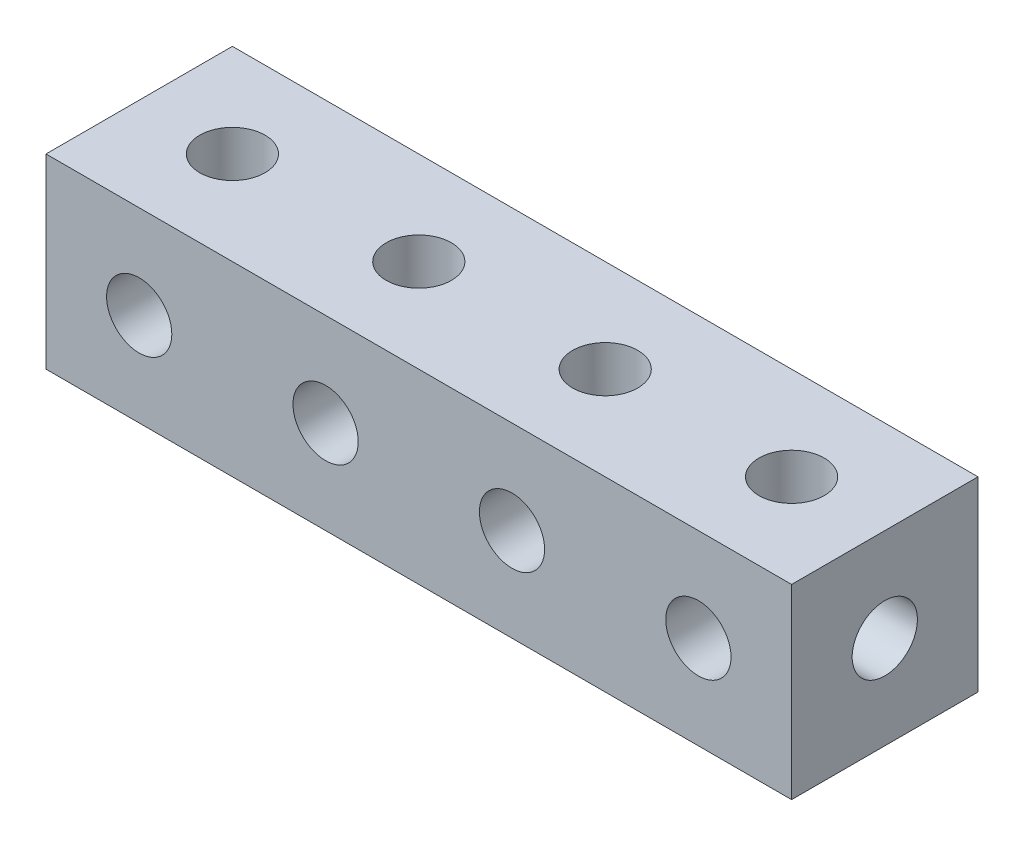
ISO-10303-21;
HEADER;
FILE_DESCRIPTION(('STEP AP214'),'2;1');
FILE_NAME('part.step','',(''),(''),'','','');
FILE_SCHEMA(('AUTOMOTIVE_DESIGN { 1 0 10303 214 1 1 1 1 }'));
ENDSEC;
DATA;
#1=APPLICATION_CONTEXT('core data for automotive mechanical design processes');
#2=APPLICATION_PROTOCOL_DEFINITION('international standard','automotive_design',2000,#1);
#3=PRODUCT_CONTEXT('',#1,'mechanical');
#4=PRODUCT('Part','Part','',(#3));
#5=PRODUCT_RELATED_PRODUCT_CATEGORY('part','',(#4));
#6=PRODUCT_DEFINITION_FORMATION('','',#4);
#7=PRODUCT_DEFINITION_CONTEXT('part definition',#1,'design');
#8=PRODUCT_DEFINITION('design','',#6,#7);
#9=PRODUCT_DEFINITION_SHAPE('','',#8);
#10=(LENGTH_UNIT() NAMED_UNIT(*) SI_UNIT(.MILLI.,.METRE.));
#11=(NAMED_UNIT(*) PLANE_ANGLE_UNIT() SI_UNIT($,.RADIAN.));
#12=(NAMED_UNIT(*) SI_UNIT($,.STERADIAN.) SOLID_ANGLE_UNIT());
#13=UNCERTAINTY_MEASURE_WITH_UNIT(LENGTH_MEASURE(1.E-05),#10,'distance_accuracy_value','');
#14=(GEOMETRIC_REPRESENTATION_CONTEXT(3) GLOBAL_UNCERTAINTY_ASSIGNED_CONTEXT((#13)) GLOBAL_UNIT_ASSIGNED_CONTEXT((#10,
#11,#12)) REPRESENTATION_CONTEXT('',''));
#15=CARTESIAN_POINT('',(0.,0.,0.));
#16=DIRECTION('',(0.,0.,1.));
#17=DIRECTION('',(1.,0.,0.));
#18=AXIS2_PLACEMENT_3D('',#15,#16,#17);
#19=CARTESIAN_POINT('',(35.,0.,-5.));
#20=DIRECTION('',(0.,1.,0.));
#21=DIRECTION('',(0.,0.,1.));
#22=AXIS2_PLACEMENT_3D('',#19,#20,#21);
#23=CYLINDRICAL_SURFACE('',#22,1.75);
#24=CARTESIAN_POINT('',(35.,10.,-5.));
#25=DIRECTION('',(0.,1.,0.));
#26=DIRECTION('',(0.,0.,1.));
#27=AXIS2_PLACEMENT_3D('',#24,#25,#26);
#28=CIRCLE('',#27,1.75);
#29=CARTESIAN_POINT('',(35.,10.,-3.25));
#30=VERTEX_POINT('',#29);
#31=EDGE_CURVE('E272',#30,#30,#28,.T.);
#32=ORIENTED_EDGE('',*,*,#31,.T.);
#33=EDGE_LOOP('',(#32));
#34=FACE_BOUND('',#33,.T.);
#35=CARTESIAN_POINT('',(35.,5.,-5.));
#36=DIRECTION('',(0.,0.707106781186547,-0.707106781186547));
#37=DIRECTION('',(0.,0.707106781186547,0.707106781186547));
#38=AXIS2_PLACEMENT_3D('',#35,#36,#37);
#39=ELLIPSE('',#38,2.47487373415292,1.75);
#40=CARTESIAN_POINT('',(36.2374368670765,6.23743686707646,-3.76256313292354));
#41=VERTEX_POINT('',#40);
#42=CARTESIAN_POINT('',(33.7625631329235,6.23743686707646,-3.76256313292354));
#43=VERTEX_POINT('',#42);
#44=EDGE_CURVE('E186',#41,#43,#39,.F.);
#45=ORIENTED_EDGE('',*,*,#44,.T.);
#46=CARTESIAN_POINT('',(35.,5.,-5.));
#47=DIRECTION('',(0.707106781186547,0.707106781186547,0.));
#48=DIRECTION('',(-0.707106781186547,0.707106781186547,0.));
#49=AXIS2_PLACEMENT_3D('',#46,#47,#48);
#50=ELLIPSE('',#49,2.47487373415292,1.75);
#51=CARTESIAN_POINT('',(33.7625631329235,6.23743686707646,-6.23743686707646));
#52=VERTEX_POINT('',#51);
#53=EDGE_CURVE('E172',#43,#52,#50,.F.);
#54=ORIENTED_EDGE('',*,*,#53,.T.);
#55=CARTESIAN_POINT('',(35.,5.,-5.));
#56=DIRECTION('',(0.,0.707106781186547,0.707106781186547));
#57=DIRECTION('',(0.,0.707106781186547,-0.707106781186547));
#58=AXIS2_PLACEMENT_3D('',#55,#56,#57);
#59=ELLIPSE('',#58,2.47487373415292,1.75);
#60=CARTESIAN_POINT('',(36.2374368670765,6.23743686707646,-6.23743686707646));
#61=VERTEX_POINT('',#60);
#62=EDGE_CURVE('E180',#52,#61,#59,.F.);
#63=ORIENTED_EDGE('',*,*,#62,.T.);
#64=CARTESIAN_POINT('',(35.,5.,-5.));
#65=DIRECTION('',(-0.707106781186547,0.707106781186547,0.));
#66=DIRECTION('',(0.707106781186547,0.707106781186547,0.));
#67=AXIS2_PLACEMENT_3D('',#64,#65,#66);
#68=ELLIPSE('',#67,2.47487373415292,1.75);
#69=EDGE_CURVE('E382',#61,#41,#68,.F.);
#70=ORIENTED_EDGE('',*,*,#69,.T.);
#71=EDGE_LOOP('',(#45,#54,#63,#70));
#72=FACE_BOUND('',#71,.T.);
#73=ADVANCED_FACE('F33',(#34,#72),#23,.F.);
#74=CARTESIAN_POINT('',(25.,0.,-5.));
#75=DIRECTION('',(0.,1.,0.));
#76=DIRECTION('',(0.,0.,1.));
#77=AXIS2_PLACEMENT_3D('',#74,#75,#76);
#78=CYLINDRICAL_SURFACE('',#77,1.75);
#79=CARTESIAN_POINT('',(25.,10.,-5.));
#80=DIRECTION('',(0.,1.,0.));
#81=DIRECTION('',(0.,0.,1.));
#82=AXIS2_PLACEMENT_3D('',#79,#80,#81);
#83=CIRCLE('',#82,1.75);
#84=CARTESIAN_POINT('',(25.,10.,-3.25));
#85=VERTEX_POINT('',#84);
#86=EDGE_CURVE('E279',#85,#85,#83,.T.);
#87=ORIENTED_EDGE('',*,*,#86,.T.);
#88=EDGE_LOOP('',(#87));
#89=FACE_BOUND('',#88,.T.);
#90=CARTESIAN_POINT('',(25.,5.,-5.));
#91=DIRECTION('',(0.,0.707106781186547,-0.707106781186547));
#92=DIRECTION('',(0.,0.707106781186547,0.707106781186547));
#93=AXIS2_PLACEMENT_3D('',#90,#91,#92);
#94=ELLIPSE('',#93,2.47487373415292,1.75);
#95=CARTESIAN_POINT('',(26.2374368670765,6.23743686707646,-3.76256313292354));
#96=VERTEX_POINT('',#95);
#97=CARTESIAN_POINT('',(23.7625631329235,6.23743686707646,-3.76256313292354));
#98=VERTEX_POINT('',#97);
#99=EDGE_CURVE('E208',#96,#98,#94,.F.);
#100=ORIENTED_EDGE('',*,*,#99,.T.);
#101=CARTESIAN_POINT('',(25.,5.,-5.));
#102=DIRECTION('',(0.707106781186547,0.707106781186547,0.));
#103=DIRECTION('',(-0.707106781186547,0.707106781186547,0.));
#104=AXIS2_PLACEMENT_3D('',#101,#102,#103);
#105=ELLIPSE('',#104,2.47487373415292,1.75);
#106=CARTESIAN_POINT('',(23.7625631329235,6.23743686707646,-6.23743686707646));
#107=VERTEX_POINT('',#106);
#108=EDGE_CURVE('E370',#98,#107,#105,.F.);
#109=ORIENTED_EDGE('',*,*,#108,.T.);
#110=CARTESIAN_POINT('',(25.,5.,-5.));
#111=DIRECTION('',(0.,0.707106781186547,0.707106781186547));
#112=DIRECTION('',(0.,0.707106781186547,-0.707106781186547));
#113=AXIS2_PLACEMENT_3D('',#110,#111,#112);
#114=ELLIPSE('',#113,2.47487373415292,1.75);
#115=CARTESIAN_POINT('',(26.2374368670765,6.23743686707646,-6.23743686707646));
#116=VERTEX_POINT('',#115);
#117=EDGE_CURVE('E199',#107,#116,#114,.F.);
#118=ORIENTED_EDGE('',*,*,#117,.T.);
#119=CARTESIAN_POINT('',(25.,5.,-5.));
#120=DIRECTION('',(-0.707106781186547,0.707106781186547,0.));
#121=DIRECTION('',(0.707106781186547,0.707106781186547,0.));
#122=AXIS2_PLACEMENT_3D('',#119,#120,#121);
#123=ELLIPSE('',#122,2.47487373415292,1.75);
#124=EDGE_CURVE('E358',#116,#96,#123,.F.);
#125=ORIENTED_EDGE('',*,*,#124,.T.);
#126=EDGE_LOOP('',(#100,#109,#118,#125));
#127=FACE_BOUND('',#126,.T.);
#128=ADVANCED_FACE('F413',(#89,#127),#78,.F.);
#129=CARTESIAN_POINT('',(15.,0.,-5.));
#130=DIRECTION('',(0.,1.,0.));
#131=DIRECTION('',(0.,0.,1.));
#132=AXIS2_PLACEMENT_3D('',#129,#130,#131);
#133=CYLINDRICAL_SURFACE('',#132,1.75);
#134=CARTESIAN_POINT('',(15.,10.,-5.));
#135=DIRECTION('',(0.,1.,0.));
#136=DIRECTION('',(0.,0.,1.));
#137=AXIS2_PLACEMENT_3D('',#134,#135,#136);
#138=CIRCLE('',#137,1.75);
#139=CARTESIAN_POINT('',(15.,10.,-3.25));
#140=VERTEX_POINT('',#139);
#141=EDGE_CURVE('E285',#140,#140,#138,.T.);
#142=ORIENTED_EDGE('',*,*,#141,.T.);
#143=EDGE_LOOP('',(#142));
#144=FACE_BOUND('',#143,.T.);
#145=CARTESIAN_POINT('',(15.,5.,-5.));
#146=DIRECTION('',(0.,0.707106781186547,-0.707106781186547));
#147=DIRECTION('',(0.,0.707106781186547,0.707106781186547));
#148=AXIS2_PLACEMENT_3D('',#145,#146,#147);
#149=ELLIPSE('',#148,2.47487373415291,1.75);
#150=CARTESIAN_POINT('',(16.2374368670765,6.23743686707646,-3.76256313292354));
#151=VERTEX_POINT('',#150);
#152=CARTESIAN_POINT('',(13.7625631329235,6.23743686707646,-3.76256313292354));
#153=VERTEX_POINT('',#152);
#154=EDGE_CURVE('E220',#151,#153,#149,.F.);
#155=ORIENTED_EDGE('',*,*,#154,.T.);
#156=CARTESIAN_POINT('',(15.,5.,-5.));
#157=DIRECTION('',(0.707106781186547,0.707106781186547,0.));
#158=DIRECTION('',(-0.707106781186547,0.707106781186547,0.));
#159=AXIS2_PLACEMENT_3D('',#156,#157,#158);
#160=ELLIPSE('',#159,2.47487373415291,1.75);
#161=CARTESIAN_POINT('',(13.7625631329235,6.23743686707646,-6.23743686707645));
#162=VERTEX_POINT('',#161);
#163=EDGE_CURVE('E346',#153,#162,#160,.F.);
#164=ORIENTED_EDGE('',*,*,#163,.T.);
#165=CARTESIAN_POINT('',(15.,5.,-5.));
#166=DIRECTION('',(0.,0.707106781186547,0.707106781186547));
#167=DIRECTION('',(0.,0.707106781186547,-0.707106781186547));
#168=AXIS2_PLACEMENT_3D('',#165,#166,#167);
#169=ELLIPSE('',#168,2.47487373415291,1.75);
#170=CARTESIAN_POINT('',(16.2374368670765,6.23743686707646,-6.23743686707645));
#171=VERTEX_POINT('',#170);
#172=EDGE_CURVE('E211',#162,#171,#169,.F.);
#173=ORIENTED_EDGE('',*,*,#172,.T.);
#174=CARTESIAN_POINT('',(15.,5.,-5.));
#175=DIRECTION('',(-0.707106781186547,0.707106781186547,0.));
#176=DIRECTION('',(0.707106781186547,0.707106781186547,0.));
#177=AXIS2_PLACEMENT_3D('',#174,#175,#176);
#178=ELLIPSE('',#177,2.47487373415291,1.75);
#179=EDGE_CURVE('E334',#171,#151,#178,.F.);
#180=ORIENTED_EDGE('',*,*,#179,.T.);
#181=EDGE_LOOP('',(#155,#164,#173,#180));
#182=FACE_BOUND('',#181,.T.);
#183=ADVANCED_FACE('F420',(#144,#182),#133,.F.);
#184=CARTESIAN_POINT('',(5.,0.,-5.));
#185=DIRECTION('',(0.,1.,0.));
#186=DIRECTION('',(0.,0.,1.));
#187=AXIS2_PLACEMENT_3D('',#184,#185,#186);
#188=CYLINDRICAL_SURFACE('',#187,1.75);
#189=CARTESIAN_POINT('',(5.,10.,-5.));
#190=DIRECTION('',(0.,1.,0.));
#191=DIRECTION('',(0.,0.,1.));
#192=AXIS2_PLACEMENT_3D('',#189,#190,#191);
#193=CIRCLE('',#192,1.75);
#194=CARTESIAN_POINT('',(5.,10.,-3.25));
#195=VERTEX_POINT('',#194);
#196=EDGE_CURVE('E266',#195,#195,#193,.T.);
#197=ORIENTED_EDGE('',*,*,#196,.T.);
#198=EDGE_LOOP('',(#197));
#199=FACE_BOUND('',#198,.T.);
#200=CARTESIAN_POINT('',(5.,5.,-5.));
#201=DIRECTION('',(0.,0.707106781186547,-0.707106781186547));
#202=DIRECTION('',(0.,0.707106781186547,0.707106781186547));
#203=AXIS2_PLACEMENT_3D('',#200,#201,#202);
#204=ELLIPSE('',#203,2.47487373415292,1.75);
#205=CARTESIAN_POINT('',(6.23743686707646,6.23743686707646,-3.76256313292354));
#206=VERTEX_POINT('',#205);
#207=CARTESIAN_POINT('',(3.76256313292354,6.23743686707646,-3.76256313292354));
#208=VERTEX_POINT('',#207);
#209=EDGE_CURVE('E232',#206,#208,#204,.F.);
#210=ORIENTED_EDGE('',*,*,#209,.T.);
#211=CARTESIAN_POINT('',(5.,5.,-5.));
#212=DIRECTION('',(0.707106781186547,0.707106781186547,0.));
#213=DIRECTION('',(-0.707106781186547,0.707106781186547,0.));
#214=AXIS2_PLACEMENT_3D('',#211,#212,#213);
#215=ELLIPSE('',#214,2.47487373415292,1.75);
#216=CARTESIAN_POINT('',(3.76256313292354,6.23743686707646,-6.23743686707646));
#217=VERTEX_POINT('',#216);
#218=EDGE_CURVE('E325',#208,#217,#215,.F.);
#219=ORIENTED_EDGE('',*,*,#218,.T.);
#220=CARTESIAN_POINT('',(5.,5.,-5.));
#221=DIRECTION('',(0.,0.707106781186547,0.707106781186547));
#222=DIRECTION('',(0.,0.707106781186547,-0.707106781186547));
#223=AXIS2_PLACEMENT_3D('',#220,#221,#222);
#224=ELLIPSE('',#223,2.47487373415292,1.75);
#225=CARTESIAN_POINT('',(6.23743686707646,6.23743686707646,-6.23743686707646));
#226=VERTEX_POINT('',#225);
#227=EDGE_CURVE('E223',#217,#226,#224,.F.);
#228=ORIENTED_EDGE('',*,*,#227,.T.);
#229=CARTESIAN_POINT('',(5.,5.,-5.));
#230=DIRECTION('',(-0.707106781186547,0.707106781186547,0.));
#231=DIRECTION('',(0.707106781186547,0.707106781186547,0.));
#232=AXIS2_PLACEMENT_3D('',#229,#230,#231);
#233=ELLIPSE('',#232,2.47487373415292,1.75);
#234=EDGE_CURVE('E48',#226,#206,#233,.F.);
#235=ORIENTED_EDGE('',*,*,#234,.T.);
#236=EDGE_LOOP('',(#210,#219,#228,#235));
#237=FACE_BOUND('',#236,.T.);
#238=ADVANCED_FACE('F435',(#199,#237),#188,.F.);
#239=CARTESIAN_POINT('',(40.,0.,0.));
#240=DIRECTION('',(0.,0.,-1.));
#241=DIRECTION('',(0.,1.,0.));
#242=AXIS2_PLACEMENT_3D('',#239,#240,#241);
#243=PLANE('',#242);
#244=CARTESIAN_POINT('',(15.,5.,0.));
#245=DIRECTION('',(0.,0.,1.));
#246=DIRECTION('',(1.,0.,0.));
#247=AXIS2_PLACEMENT_3D('',#244,#245,#246);
#248=CIRCLE('',#247,1.75);
#249=CARTESIAN_POINT('',(16.75,5.,0.));
#250=VERTEX_POINT('',#249);
#251=EDGE_CURVE('E304',#250,#250,#248,.T.);
#252=ORIENTED_EDGE('',*,*,#251,.F.);
#253=EDGE_LOOP('',(#252));
#254=FACE_BOUND('',#253,.T.);
#255=CARTESIAN_POINT('',(25.,5.,0.));
#256=DIRECTION('',(0.,0.,1.));
#257=DIRECTION('',(1.,0.,0.));
#258=AXIS2_PLACEMENT_3D('',#255,#256,#257);
#259=CIRCLE('',#258,1.75);
#260=CARTESIAN_POINT('',(26.75,5.,0.));
#261=VERTEX_POINT('',#260);
#262=EDGE_CURVE('E308',#261,#261,#259,.T.);
#263=ORIENTED_EDGE('',*,*,#262,.F.);
#264=EDGE_LOOP('',(#263));
#265=FACE_BOUND('',#264,.T.);
#266=CARTESIAN_POINT('',(35.,5.,0.));
#267=DIRECTION('',(0.,0.,1.));
#268=DIRECTION('',(1.,0.,0.));
#269=AXIS2_PLACEMENT_3D('',#266,#267,#268);
#270=CIRCLE('',#269,1.75);
#271=CARTESIAN_POINT('',(36.75,5.,0.));
#272=VERTEX_POINT('',#271);
#273=EDGE_CURVE('E305',#272,#272,#270,.T.);
#274=ORIENTED_EDGE('',*,*,#273,.F.);
#275=EDGE_LOOP('',(#274));
#276=FACE_BOUND('',#275,.T.);
#277=CARTESIAN_POINT('',(5.,5.,0.));
#278=DIRECTION('',(0.,0.,1.));
#279=DIRECTION('',(1.,0.,0.));
#280=AXIS2_PLACEMENT_3D('',#277,#278,#279);
#281=CIRCLE('',#280,1.75);
#282=CARTESIAN_POINT('',(6.75,5.,0.));
#283=VERTEX_POINT('',#282);
#284=EDGE_CURVE('E292',#283,#283,#281,.T.);
#285=ORIENTED_EDGE('',*,*,#284,.F.);
#286=EDGE_LOOP('',(#285));
#287=FACE_BOUND('',#286,.T.);
#288=DIRECTION('',(0.,-1.,0.));
#289=VECTOR('',#288,1.);
#290=CARTESIAN_POINT('',(0.,0.,0.));
#291=LINE('',#290,#289);
#292=CARTESIAN_POINT('',(0.,10.,0.));
#293=VERTEX_POINT('',#292);
#294=CARTESIAN_POINT('',(0.,0.,0.));
#295=VERTEX_POINT('',#294);
#296=EDGE_CURVE('E255',#293,#295,#291,.T.);
#297=ORIENTED_EDGE('',*,*,#296,.T.);
#298=DIRECTION('',(-1.,0.,0.));
#299=VECTOR('',#298,1.);
#300=CARTESIAN_POINT('',(40.,0.,0.));
#301=LINE('',#300,#299);
#302=CARTESIAN_POINT('',(40.,0.,0.));
#303=VERTEX_POINT('',#302);
#304=EDGE_CURVE('E235',#303,#295,#301,.T.);
#305=ORIENTED_EDGE('',*,*,#304,.F.);
#306=DIRECTION('',(0.,-1.,0.));
#307=VECTOR('',#306,1.);
#308=CARTESIAN_POINT('',(40.,0.,0.));
#309=LINE('',#308,#307);
#310=CARTESIAN_POINT('',(40.,10.,0.));
#311=VERTEX_POINT('',#310);
#312=EDGE_CURVE('E250',#311,#303,#309,.T.);
#313=ORIENTED_EDGE('',*,*,#312,.F.);
#314=DIRECTION('',(-1.,0.,0.));
#315=VECTOR('',#314,1.);
#316=CARTESIAN_POINT('',(40.,10.,0.));
#317=LINE('',#316,#315);
#318=EDGE_CURVE('E244',#311,#293,#317,.T.);
#319=ORIENTED_EDGE('',*,*,#318,.T.);
#320=EDGE_LOOP('',(#297,#305,#313,#319));
#321=FACE_BOUND('',#320,.T.);
#322=ADVANCED_FACE('F35',(#254,#265,#276,#287,#321),#243,.F.);
#323=CARTESIAN_POINT('',(40.,0.,0.));
#324=DIRECTION('',(0.,1.,0.));
#325=DIRECTION('',(0.,0.,1.));
#326=AXIS2_PLACEMENT_3D('',#323,#324,#325);
#327=PLANE('',#326);
#328=CARTESIAN_POINT('',(15.,0.,-5.));
#329=DIRECTION('',(0.,1.,0.));
#330=DIRECTION('',(0.,0.,1.));
#331=AXIS2_PLACEMENT_3D('',#328,#329,#330);
#332=CIRCLE('',#331,1.75);
#333=CARTESIAN_POINT('',(15.,0.,-3.25));
#334=VERTEX_POINT('',#333);
#335=EDGE_CURVE('E269',#334,#334,#332,.T.);
#336=ORIENTED_EDGE('',*,*,#335,.T.);
#337=EDGE_LOOP('',(#336));
#338=FACE_BOUND('',#337,.T.);
#339=CARTESIAN_POINT('',(25.,0.,-5.));
#340=DIRECTION('',(0.,1.,0.));
#341=DIRECTION('',(0.,0.,1.));
#342=AXIS2_PLACEMENT_3D('',#339,#340,#341);
#343=CIRCLE('',#342,1.75);
#344=CARTESIAN_POINT('',(25.,0.,-3.25));
#345=VERTEX_POINT('',#344);
#346=EDGE_CURVE('E282',#345,#345,#343,.T.);
#347=ORIENTED_EDGE('',*,*,#346,.T.);
#348=EDGE_LOOP('',(#347));
#349=FACE_BOUND('',#348,.T.);
#350=CARTESIAN_POINT('',(35.,0.,-5.));
#351=DIRECTION('',(0.,1.,0.));
#352=DIRECTION('',(0.,0.,1.));
#353=AXIS2_PLACEMENT_3D('',#350,#351,#352);
#354=CIRCLE('',#353,1.75);
#355=CARTESIAN_POINT('',(35.,0.,-3.25));
#356=VERTEX_POINT('',#355);
#357=EDGE_CURVE('E275',#356,#356,#354,.T.);
#358=ORIENTED_EDGE('',*,*,#357,.T.);
#359=EDGE_LOOP('',(#358));
#360=FACE_BOUND('',#359,.T.);
#361=CARTESIAN_POINT('',(5.,0.,-5.));
#362=DIRECTION('',(0.,1.,0.));
#363=DIRECTION('',(0.,0.,1.));
#364=AXIS2_PLACEMENT_3D('',#361,#362,#363);
#365=CIRCLE('',#364,1.75);
#366=CARTESIAN_POINT('',(5.,0.,-3.25));
#367=VERTEX_POINT('',#366);
#368=EDGE_CURVE('E258',#367,#367,#365,.T.);
#369=ORIENTED_EDGE('',*,*,#368,.T.);
#370=EDGE_LOOP('',(#369));
#371=FACE_BOUND('',#370,.T.);
#372=DIRECTION('',(0.,0.,-1.));
#373=VECTOR('',#372,1.);
#374=CARTESIAN_POINT('',(0.,0.,0.));
#375=LINE('',#374,#373);
#376=CARTESIAN_POINT('',(0.,0.,-10.));
#377=VERTEX_POINT('',#376);
#378=EDGE_CURVE('E253',#295,#377,#375,.T.);
#379=ORIENTED_EDGE('',*,*,#378,.T.);
#380=DIRECTION('',(-1.,0.,0.));
#381=VECTOR('',#380,1.);
#382=CARTESIAN_POINT('',(40.,0.,-10.));
#383=LINE('',#382,#381);
#384=CARTESIAN_POINT('',(40.,0.,-10.));
#385=VERTEX_POINT('',#384);
#386=EDGE_CURVE('E238',#385,#377,#383,.T.);
#387=ORIENTED_EDGE('',*,*,#386,.F.);
#388=DIRECTION('',(0.,0.,-1.));
#389=VECTOR('',#388,1.);
#390=CARTESIAN_POINT('',(40.,0.,0.));
#391=LINE('',#390,#389);
#392=EDGE_CURVE('E262',#303,#385,#391,.T.);
#393=ORIENTED_EDGE('',*,*,#392,.F.);
#394=ORIENTED_EDGE('',*,*,#304,.T.);
#395=EDGE_LOOP('',(#379,#387,#393,#394));
#396=FACE_BOUND('',#395,.T.);
#397=ADVANCED_FACE('F440',(#338,#349,#360,#371,#396),#327,.F.);
#398=CARTESIAN_POINT('',(40.,0.,-10.));
#399=DIRECTION('',(0.,0.,1.));
#400=DIRECTION('',(1.,0.,0.));
#401=AXIS2_PLACEMENT_3D('',#398,#399,#400);
#402=PLANE('',#401);
#403=CARTESIAN_POINT('',(15.,5.,-10.));
#404=DIRECTION('',(0.,0.,1.));
#405=DIRECTION('',(1.,0.,0.));
#406=AXIS2_PLACEMENT_3D('',#403,#404,#405);
#407=CIRCLE('',#406,1.75);
#408=CARTESIAN_POINT('',(16.75,5.,-10.));
#409=VERTEX_POINT('',#408);
#410=EDGE_CURVE('E301',#409,#409,#407,.T.);
#411=ORIENTED_EDGE('',*,*,#410,.T.);
#412=EDGE_LOOP('',(#411));
#413=FACE_BOUND('',#412,.T.);
#414=CARTESIAN_POINT('',(25.,5.,-10.));
#415=DIRECTION('',(0.,0.,1.));
#416=DIRECTION('',(1.,0.,0.));
#417=AXIS2_PLACEMENT_3D('',#414,#415,#416);
#418=CIRCLE('',#417,1.75);
#419=CARTESIAN_POINT('',(26.75,5.,-10.));
#420=VERTEX_POINT('',#419);
#421=EDGE_CURVE('E298',#420,#420,#418,.T.);
#422=ORIENTED_EDGE('',*,*,#421,.T.);
#423=EDGE_LOOP('',(#422));
#424=FACE_BOUND('',#423,.T.);
#425=CARTESIAN_POINT('',(35.,5.,-10.));
#426=DIRECTION('',(0.,0.,1.));
#427=DIRECTION('',(1.,0.,0.));
#428=AXIS2_PLACEMENT_3D('',#425,#426,#427);
#429=CIRCLE('',#428,1.75);
#430=CARTESIAN_POINT('',(36.75,5.,-10.));
#431=VERTEX_POINT('',#430);
#432=EDGE_CURVE('E295',#431,#431,#429,.T.);
#433=ORIENTED_EDGE('',*,*,#432,.T.);
#434=EDGE_LOOP('',(#433));
#435=FACE_BOUND('',#434,.T.);
#436=CARTESIAN_POINT('',(5.,5.,-10.));
#437=DIRECTION('',(0.,0.,1.));
#438=DIRECTION('',(1.,0.,0.));
#439=AXIS2_PLACEMENT_3D('',#436,#437,#438);
#440=CIRCLE('',#439,1.75);
#441=CARTESIAN_POINT('',(6.75,5.,-10.));
#442=VERTEX_POINT('',#441);
#443=EDGE_CURVE('E276',#442,#442,#440,.T.);
#444=ORIENTED_EDGE('',*,*,#443,.T.);
#445=EDGE_LOOP('',(#444));
#446=FACE_BOUND('',#445,.T.);
#447=DIRECTION('',(0.,1.,0.));
#448=VECTOR('',#447,1.);
#449=CARTESIAN_POINT('',(0.,0.,-10.));
#450=LINE('',#449,#448);
#451=CARTESIAN_POINT('',(0.,10.,-10.));
#452=VERTEX_POINT('',#451);
#453=EDGE_CURVE('E251',#377,#452,#450,.T.);
#454=ORIENTED_EDGE('',*,*,#453,.T.);
#455=DIRECTION('',(-1.,0.,0.));
#456=VECTOR('',#455,1.);
#457=CARTESIAN_POINT('',(40.,10.,-10.));
#458=LINE('',#457,#456);
#459=CARTESIAN_POINT('',(40.,10.,-10.));
#460=VERTEX_POINT('',#459);
#461=EDGE_CURVE('E241',#460,#452,#458,.T.);
#462=ORIENTED_EDGE('',*,*,#461,.F.);
#463=DIRECTION('',(0.,1.,0.));
#464=VECTOR('',#463,1.);
#465=CARTESIAN_POINT('',(40.,0.,-10.));
#466=LINE('',#465,#464);
#467=EDGE_CURVE('E260',#385,#460,#466,.T.);
#468=ORIENTED_EDGE('',*,*,#467,.F.);
#469=ORIENTED_EDGE('',*,*,#386,.T.);
#470=EDGE_LOOP('',(#454,#462,#468,#469));
#471=FACE_BOUND('',#470,.T.);
#472=ADVANCED_FACE('F443',(#413,#424,#435,#446,#471),#402,.F.);
#473=CARTESIAN_POINT('',(40.,10.,0.));
#474=DIRECTION('',(0.,-1.,0.));
#475=DIRECTION('',(0.,0.,-1.));
#476=AXIS2_PLACEMENT_3D('',#473,#474,#475);
#477=PLANE('',#476);
#478=ORIENTED_EDGE('',*,*,#141,.F.);
#479=EDGE_LOOP('',(#478));
#480=FACE_BOUND('',#479,.T.);
#481=ORIENTED_EDGE('',*,*,#86,.F.);
#482=EDGE_LOOP('',(#481));
#483=FACE_BOUND('',#482,.T.);
#484=ORIENTED_EDGE('',*,*,#31,.F.);
#485=EDGE_LOOP('',(#484));
#486=FACE_BOUND('',#485,.T.);
#487=ORIENTED_EDGE('',*,*,#196,.F.);
#488=EDGE_LOOP('',(#487));
#489=FACE_BOUND('',#488,.T.);
#490=DIRECTION('',(0.,0.,1.));
#491=VECTOR('',#490,1.);
#492=CARTESIAN_POINT('',(0.,10.,0.));
#493=LINE('',#492,#491);
#494=EDGE_CURVE('E248',#452,#293,#493,.T.);
#495=ORIENTED_EDGE('',*,*,#494,.T.);
#496=ORIENTED_EDGE('',*,*,#318,.F.);
#497=DIRECTION('',(0.,0.,1.));
#498=VECTOR('',#497,1.);
#499=CARTESIAN_POINT('',(40.,10.,0.));
#500=LINE('',#499,#498);
#501=EDGE_CURVE('E247',#460,#311,#500,.T.);
#502=ORIENTED_EDGE('',*,*,#501,.F.);
#503=ORIENTED_EDGE('',*,*,#461,.T.);
#504=EDGE_LOOP('',(#495,#496,#502,#503));
#505=FACE_BOUND('',#504,.T.);
#506=ADVANCED_FACE('F457',(#480,#483,#486,#489,#505),#477,.F.);
#507=CARTESIAN_POINT('',(40.,0.,0.));
#508=DIRECTION('',(-1.,0.,0.));
#509=DIRECTION('',(0.,0.,1.));
#510=AXIS2_PLACEMENT_3D('',#507,#508,#509);
#511=PLANE('',#510);
#512=CARTESIAN_POINT('',(40.,5.,-5.));
#513=DIRECTION('',(1.,0.,0.));
#514=DIRECTION('',(0.,0.,-1.));
#515=AXIS2_PLACEMENT_3D('',#512,#513,#514);
#516=CIRCLE('',#515,1.75);
#517=CARTESIAN_POINT('',(40.,5.,-6.75));
#518=VERTEX_POINT('',#517);
#519=EDGE_CURVE('E390',#518,#518,#516,.T.);
#520=ORIENTED_EDGE('',*,*,#519,.F.);
#521=EDGE_LOOP('',(#520));
#522=FACE_BOUND('',#521,.T.);
#523=ORIENTED_EDGE('',*,*,#312,.T.);
#524=ORIENTED_EDGE('',*,*,#392,.T.);
#525=ORIENTED_EDGE('',*,*,#467,.T.);
#526=ORIENTED_EDGE('',*,*,#501,.T.);
#527=EDGE_LOOP('',(#523,#524,#525,#526));
#528=FACE_BOUND('',#527,.T.);
#529=ADVANCED_FACE('F462',(#522,#528),#511,.F.);
#530=CARTESIAN_POINT('',(0.,0.,0.));
#531=DIRECTION('',(-1.,0.,0.));
#532=DIRECTION('',(0.,0.,1.));
#533=AXIS2_PLACEMENT_3D('',#530,#531,#532);
#534=PLANE('',#533);
#535=CARTESIAN_POINT('',(0.,5.,-5.));
#536=DIRECTION('',(1.,0.,0.));
#537=DIRECTION('',(0.,0.,-1.));
#538=AXIS2_PLACEMENT_3D('',#535,#536,#537);
#539=CIRCLE('',#538,1.75);
#540=CARTESIAN_POINT('',(0.,5.,-6.75));
#541=VERTEX_POINT('',#540);
#542=EDGE_CURVE('E389',#541,#541,#539,.T.);
#543=ORIENTED_EDGE('',*,*,#542,.T.);
#544=EDGE_LOOP('',(#543));
#545=FACE_BOUND('',#544,.T.);
#546=ORIENTED_EDGE('',*,*,#296,.F.);
#547=ORIENTED_EDGE('',*,*,#494,.F.);
#548=ORIENTED_EDGE('',*,*,#453,.F.);
#549=ORIENTED_EDGE('',*,*,#378,.F.);
#550=EDGE_LOOP('',(#546,#547,#548,#549));
#551=FACE_BOUND('',#550,.T.);
#552=ADVANCED_FACE('F396',(#545,#551),#534,.T.);
#553=CARTESIAN_POINT('',(5.,5.,-5.));
#554=DIRECTION('',(0.,0.707106781186547,0.707106781186547));
#555=DIRECTION('',(0.,0.707106781186547,-0.707106781186547));
#556=AXIS2_PLACEMENT_3D('',#553,#554,#555);
#557=ELLIPSE('',#556,2.47487373415292,1.75);
#558=CARTESIAN_POINT('',(3.76256313292354,3.76256313292354,-3.76256313292354));
#559=VERTEX_POINT('',#558);
#560=CARTESIAN_POINT('',(6.23743686707646,3.76256313292354,-3.76256313292354));
#561=VERTEX_POINT('',#560);
#562=EDGE_CURVE('E226',#559,#561,#557,.T.);
#563=ORIENTED_EDGE('',*,*,#562,.T.);
#564=CARTESIAN_POINT('',(5.,5.,-5.));
#565=DIRECTION('',(0.707106781186547,0.707106781186547,0.));
#566=DIRECTION('',(-0.707106781186547,0.707106781186547,0.));
#567=AXIS2_PLACEMENT_3D('',#564,#565,#566);
#568=ELLIPSE('',#567,2.47487373415292,1.75);
#569=CARTESIAN_POINT('',(6.23743686707646,3.76256313292354,-6.23743686707646));
#570=VERTEX_POINT('',#569);
#571=EDGE_CURVE('E317',#561,#570,#568,.T.);
#572=ORIENTED_EDGE('',*,*,#571,.T.);
#573=CARTESIAN_POINT('',(5.,5.,-5.));
#574=DIRECTION('',(0.,0.707106781186547,-0.707106781186547));
#575=DIRECTION('',(0.,0.707106781186547,0.707106781186547));
#576=AXIS2_PLACEMENT_3D('',#573,#574,#575);
#577=ELLIPSE('',#576,2.47487373415292,1.75);
#578=CARTESIAN_POINT('',(3.76256313292354,3.76256313292354,-6.23743686707646));
#579=VERTEX_POINT('',#578);
#580=EDGE_CURVE('E229',#570,#579,#577,.T.);
#581=ORIENTED_EDGE('',*,*,#580,.T.);
#582=CARTESIAN_POINT('',(5.,5.,-5.));
#583=DIRECTION('',(-0.707106781186547,0.707106781186547,0.));
#584=DIRECTION('',(0.707106781186547,0.707106781186547,0.));
#585=AXIS2_PLACEMENT_3D('',#582,#583,#584);
#586=ELLIPSE('',#585,2.47487373415292,1.75);
#587=EDGE_CURVE('E56',#579,#559,#586,.T.);
#588=ORIENTED_EDGE('',*,*,#587,.T.);
#589=EDGE_LOOP('',(#563,#572,#581,#588));
#590=FACE_BOUND('',#589,.T.);
#591=ORIENTED_EDGE('',*,*,#368,.F.);
#592=EDGE_LOOP('',(#591));
#593=FACE_BOUND('',#592,.T.);
#594=ADVANCED_FACE('F426',(#590,#593),#188,.F.);
#595=CARTESIAN_POINT('',(35.,5.,-5.));
#596=DIRECTION('',(0.,0.707106781186547,0.707106781186547));
#597=DIRECTION('',(0.,0.707106781186547,-0.707106781186547));
#598=AXIS2_PLACEMENT_3D('',#595,#596,#597);
#599=ELLIPSE('',#598,2.47487373415292,1.75);
#600=CARTESIAN_POINT('',(33.7625631329235,3.76256313292354,-3.76256313292354));
#601=VERTEX_POINT('',#600);
#602=CARTESIAN_POINT('',(36.2374368670765,3.76256313292354,-3.76256313292354));
#603=VERTEX_POINT('',#602);
#604=EDGE_CURVE('E191',#601,#603,#599,.T.);
#605=ORIENTED_EDGE('',*,*,#604,.T.);
#606=CARTESIAN_POINT('',(35.,5.,-5.));
#607=DIRECTION('',(0.707106781186547,0.707106781186547,0.));
#608=DIRECTION('',(-0.707106781186547,0.707106781186547,0.));
#609=AXIS2_PLACEMENT_3D('',#606,#607,#608);
#610=ELLIPSE('',#609,2.47487373415292,1.75);
#611=CARTESIAN_POINT('',(36.2374368670765,3.76256313292354,-6.23743686707646));
#612=VERTEX_POINT('',#611);
#613=EDGE_CURVE('E384',#603,#612,#610,.T.);
#614=ORIENTED_EDGE('',*,*,#613,.T.);
#615=CARTESIAN_POINT('',(35.,5.,-5.));
#616=DIRECTION('',(0.,0.707106781186547,-0.707106781186547));
#617=DIRECTION('',(0.,0.707106781186547,0.707106781186547));
#618=AXIS2_PLACEMENT_3D('',#615,#616,#617);
#619=ELLIPSE('',#618,2.47487373415292,1.75);
#620=CARTESIAN_POINT('',(33.7625631329235,3.76256313292354,-6.23743686707646));
#621=VERTEX_POINT('',#620);
#622=EDGE_CURVE('E194',#612,#621,#619,.T.);
#623=ORIENTED_EDGE('',*,*,#622,.T.);
#624=CARTESIAN_POINT('',(35.,5.,-5.));
#625=DIRECTION('',(-0.707106781186547,0.707106781186547,0.));
#626=DIRECTION('',(0.707106781186547,0.707106781186547,0.));
#627=AXIS2_PLACEMENT_3D('',#624,#625,#626);
#628=ELLIPSE('',#627,2.47487373415292,1.75);
#629=EDGE_CURVE('E175',#621,#601,#628,.T.);
#630=ORIENTED_EDGE('',*,*,#629,.T.);
#631=EDGE_LOOP('',(#605,#614,#623,#630));
#632=FACE_BOUND('',#631,.T.);
#633=ORIENTED_EDGE('',*,*,#357,.F.);
#634=EDGE_LOOP('',(#633));
#635=FACE_BOUND('',#634,.T.);
#636=ADVANCED_FACE('F416',(#632,#635),#23,.F.);
#637=CARTESIAN_POINT('',(25.,5.,-5.));
#638=DIRECTION('',(0.,0.707106781186547,0.707106781186547));
#639=DIRECTION('',(0.,0.707106781186547,-0.707106781186547));
#640=AXIS2_PLACEMENT_3D('',#637,#638,#639);
#641=ELLIPSE('',#640,2.47487373415292,1.75);
#642=CARTESIAN_POINT('',(23.7625631329235,3.76256313292354,-3.76256313292354));
#643=VERTEX_POINT('',#642);
#644=CARTESIAN_POINT('',(26.2374368670765,3.76256313292354,-3.76256313292354));
#645=VERTEX_POINT('',#644);
#646=EDGE_CURVE('E202',#643,#645,#641,.T.);
#647=ORIENTED_EDGE('',*,*,#646,.T.);
#648=CARTESIAN_POINT('',(25.,5.,-5.));
#649=DIRECTION('',(0.707106781186547,0.707106781186547,0.));
#650=DIRECTION('',(-0.707106781186547,0.707106781186547,0.));
#651=AXIS2_PLACEMENT_3D('',#648,#649,#650);
#652=ELLIPSE('',#651,2.47487373415292,1.75);
#653=CARTESIAN_POINT('',(26.2374368670765,3.76256313292354,-6.23743686707646));
#654=VERTEX_POINT('',#653);
#655=EDGE_CURVE('E361',#645,#654,#652,.T.);
#656=ORIENTED_EDGE('',*,*,#655,.T.);
#657=CARTESIAN_POINT('',(25.,5.,-5.));
#658=DIRECTION('',(0.,0.707106781186547,-0.707106781186547));
#659=DIRECTION('',(0.,0.707106781186547,0.707106781186547));
#660=AXIS2_PLACEMENT_3D('',#657,#658,#659);
#661=ELLIPSE('',#660,2.47487373415292,1.75);
#662=CARTESIAN_POINT('',(23.7625631329235,3.76256313292354,-6.23743686707646));
#663=VERTEX_POINT('',#662);
#664=EDGE_CURVE('E205',#654,#663,#661,.T.);
#665=ORIENTED_EDGE('',*,*,#664,.T.);
#666=CARTESIAN_POINT('',(25.,5.,-5.));
#667=DIRECTION('',(-0.707106781186547,0.707106781186547,0.));
#668=DIRECTION('',(0.707106781186547,0.707106781186547,0.));
#669=AXIS2_PLACEMENT_3D('',#666,#667,#668);
#670=ELLIPSE('',#669,2.47487373415292,1.75);
#671=EDGE_CURVE('E373',#663,#643,#670,.T.);
#672=ORIENTED_EDGE('',*,*,#671,.T.);
#673=EDGE_LOOP('',(#647,#656,#665,#672));
#674=FACE_BOUND('',#673,.T.);
#675=ORIENTED_EDGE('',*,*,#346,.F.);
#676=EDGE_LOOP('',(#675));
#677=FACE_BOUND('',#676,.T.);
#678=ADVANCED_FACE('F423',(#674,#677),#78,.F.);
#679=CARTESIAN_POINT('',(15.,5.,-5.));
#680=DIRECTION('',(0.,0.707106781186547,0.707106781186547));
#681=DIRECTION('',(0.,0.707106781186547,-0.707106781186547));
#682=AXIS2_PLACEMENT_3D('',#679,#680,#681);
#683=ELLIPSE('',#682,2.47487373415291,1.75);
#684=CARTESIAN_POINT('',(13.7625631329235,3.76256313292354,-3.76256313292354));
#685=VERTEX_POINT('',#684);
#686=CARTESIAN_POINT('',(16.2374368670765,3.76256313292354,-3.76256313292354));
#687=VERTEX_POINT('',#686);
#688=EDGE_CURVE('E214',#685,#687,#683,.T.);
#689=ORIENTED_EDGE('',*,*,#688,.T.);
#690=CARTESIAN_POINT('',(15.,5.,-5.));
#691=DIRECTION('',(0.707106781186547,0.707106781186547,0.));
#692=DIRECTION('',(-0.707106781186547,0.707106781186547,0.));
#693=AXIS2_PLACEMENT_3D('',#690,#691,#692);
#694=ELLIPSE('',#693,2.47487373415291,1.75);
#695=CARTESIAN_POINT('',(16.2374368670765,3.76256313292354,-6.23743686707645));
#696=VERTEX_POINT('',#695);
#697=EDGE_CURVE('E337',#687,#696,#694,.T.);
#698=ORIENTED_EDGE('',*,*,#697,.T.);
#699=CARTESIAN_POINT('',(15.,5.,-5.));
#700=DIRECTION('',(0.,0.707106781186547,-0.707106781186547));
#701=DIRECTION('',(0.,0.707106781186547,0.707106781186547));
#702=AXIS2_PLACEMENT_3D('',#699,#700,#701);
#703=ELLIPSE('',#702,2.47487373415291,1.75);
#704=CARTESIAN_POINT('',(13.7625631329235,3.76256313292354,-6.23743686707645));
#705=VERTEX_POINT('',#704);
#706=EDGE_CURVE('E217',#696,#705,#703,.T.);
#707=ORIENTED_EDGE('',*,*,#706,.T.);
#708=CARTESIAN_POINT('',(15.,5.,-5.));
#709=DIRECTION('',(-0.707106781186547,0.707106781186547,0.));
#710=DIRECTION('',(0.707106781186547,0.707106781186547,0.));
#711=AXIS2_PLACEMENT_3D('',#708,#709,#710);
#712=ELLIPSE('',#711,2.47487373415291,1.75);
#713=EDGE_CURVE('E349',#705,#685,#712,.T.);
#714=ORIENTED_EDGE('',*,*,#713,.T.);
#715=EDGE_LOOP('',(#689,#698,#707,#714));
#716=FACE_BOUND('',#715,.T.);
#717=ORIENTED_EDGE('',*,*,#335,.F.);
#718=EDGE_LOOP('',(#717));
#719=FACE_BOUND('',#718,.T.);
#720=ADVANCED_FACE('F432',(#716,#719),#133,.F.);
#721=CARTESIAN_POINT('',(5.,5.,-40.));
#722=DIRECTION('',(0.,0.,1.));
#723=DIRECTION('',(1.,0.,0.));
#724=AXIS2_PLACEMENT_3D('',#721,#722,#723);
#725=CYLINDRICAL_SURFACE('',#724,1.75);
#726=ORIENTED_EDGE('',*,*,#284,.T.);
#727=EDGE_LOOP('',(#726));
#728=FACE_BOUND('',#727,.T.);
#729=ORIENTED_EDGE('',*,*,#562,.F.);
#730=CARTESIAN_POINT('',(5.,5.,-5.));
#731=DIRECTION('',(0.707106781186547,0.,0.707106781186547));
#732=DIRECTION('',(-0.707106781186547,0.,0.707106781186547));
#733=AXIS2_PLACEMENT_3D('',#730,#731,#732);
#734=ELLIPSE('',#733,2.47487373415292,1.75);
#735=EDGE_CURVE('E322',#559,#208,#734,.F.);
#736=ORIENTED_EDGE('',*,*,#735,.T.);
#737=ORIENTED_EDGE('',*,*,#209,.F.);
#738=CARTESIAN_POINT('',(5.,5.,-5.));
#739=DIRECTION('',(-0.707106781186547,0.,0.707106781186547));
#740=DIRECTION('',(0.707106781186547,0.,0.707106781186547));
#741=AXIS2_PLACEMENT_3D('',#738,#739,#740);
#742=ELLIPSE('',#741,2.47487373415292,1.75);
#743=EDGE_CURVE('E309',#206,#561,#742,.F.);
#744=ORIENTED_EDGE('',*,*,#743,.T.);
#745=EDGE_LOOP('',(#729,#736,#737,#744));
#746=FACE_BOUND('',#745,.T.);
#747=ADVANCED_FACE('F490',(#728,#746),#725,.F.);
#748=ORIENTED_EDGE('',*,*,#580,.F.);
#749=CARTESIAN_POINT('',(5.,5.,-5.));
#750=DIRECTION('',(0.707106781186547,0.,0.707106781186547));
#751=DIRECTION('',(-0.707106781186547,0.,0.707106781186547));
#752=AXIS2_PLACEMENT_3D('',#749,#750,#751);
#753=ELLIPSE('',#752,2.47487373415292,1.75);
#754=EDGE_CURVE('E320',#570,#226,#753,.T.);
#755=ORIENTED_EDGE('',*,*,#754,.T.);
#756=ORIENTED_EDGE('',*,*,#227,.F.);
#757=CARTESIAN_POINT('',(5.,5.,-5.));
#758=DIRECTION('',(-0.707106781186547,0.,0.707106781186547));
#759=DIRECTION('',(0.707106781186547,0.,0.707106781186547));
#760=AXIS2_PLACEMENT_3D('',#757,#758,#759);
#761=ELLIPSE('',#760,2.47487373415292,1.75);
#762=EDGE_CURVE('E329',#217,#579,#761,.T.);
#763=ORIENTED_EDGE('',*,*,#762,.T.);
#764=EDGE_LOOP('',(#748,#755,#756,#763));
#765=FACE_BOUND('',#764,.T.);
#766=ORIENTED_EDGE('',*,*,#443,.F.);
#767=EDGE_LOOP('',(#766));
#768=FACE_BOUND('',#767,.T.);
#769=ADVANCED_FACE('F487',(#765,#768),#725,.F.);
#770=CARTESIAN_POINT('',(15.,5.,-40.));
#771=DIRECTION('',(0.,0.,1.));
#772=DIRECTION('',(1.,0.,0.));
#773=AXIS2_PLACEMENT_3D('',#770,#771,#772);
#774=CYLINDRICAL_SURFACE('',#773,1.75);
#775=ORIENTED_EDGE('',*,*,#251,.T.);
#776=EDGE_LOOP('',(#775));
#777=FACE_BOUND('',#776,.T.);
#778=ORIENTED_EDGE('',*,*,#688,.F.);
#779=CARTESIAN_POINT('',(15.,5.,-5.));
#780=DIRECTION('',(0.707106781186547,0.,0.707106781186547));
#781=DIRECTION('',(-0.707106781186547,0.,0.707106781186547));
#782=AXIS2_PLACEMENT_3D('',#779,#780,#781);
#783=ELLIPSE('',#782,2.47487373415291,1.75);
#784=EDGE_CURVE('E343',#685,#153,#783,.F.);
#785=ORIENTED_EDGE('',*,*,#784,.T.);
#786=ORIENTED_EDGE('',*,*,#154,.F.);
#787=CARTESIAN_POINT('',(15.,5.,-5.));
#788=DIRECTION('',(-0.707106781186547,0.,0.707106781186547));
#789=DIRECTION('',(0.707106781186547,0.,0.707106781186547));
#790=AXIS2_PLACEMENT_3D('',#787,#788,#789);
#791=ELLIPSE('',#790,2.47487373415291,1.75);
#792=EDGE_CURVE('E331',#151,#687,#791,.F.);
#793=ORIENTED_EDGE('',*,*,#792,.T.);
#794=EDGE_LOOP('',(#778,#785,#786,#793));
#795=FACE_BOUND('',#794,.T.);
#796=ADVANCED_FACE('F489',(#777,#795),#774,.F.);
#797=ORIENTED_EDGE('',*,*,#706,.F.);
#798=CARTESIAN_POINT('',(15.,5.,-5.));
#799=DIRECTION('',(0.707106781186547,0.,0.707106781186547));
#800=DIRECTION('',(-0.707106781186547,0.,0.707106781186547));
#801=AXIS2_PLACEMENT_3D('',#798,#799,#800);
#802=ELLIPSE('',#801,2.47487373415291,1.75);
#803=EDGE_CURVE('E340',#696,#171,#802,.T.);
#804=ORIENTED_EDGE('',*,*,#803,.T.);
#805=ORIENTED_EDGE('',*,*,#172,.F.);
#806=CARTESIAN_POINT('',(15.,5.,-5.));
#807=DIRECTION('',(-0.707106781186547,0.,0.707106781186547));
#808=DIRECTION('',(0.707106781186547,0.,0.707106781186547));
#809=AXIS2_PLACEMENT_3D('',#806,#807,#808);
#810=ELLIPSE('',#809,2.47487373415291,1.75);
#811=EDGE_CURVE('E352',#162,#705,#810,.T.);
#812=ORIENTED_EDGE('',*,*,#811,.T.);
#813=EDGE_LOOP('',(#797,#804,#805,#812));
#814=FACE_BOUND('',#813,.T.);
#815=ORIENTED_EDGE('',*,*,#410,.F.);
#816=EDGE_LOOP('',(#815));
#817=FACE_BOUND('',#816,.T.);
#818=ADVANCED_FACE('F497',(#814,#817),#774,.F.);
#819=CARTESIAN_POINT('',(25.,5.,-40.));
#820=DIRECTION('',(0.,0.,1.));
#821=DIRECTION('',(1.,0.,0.));
#822=AXIS2_PLACEMENT_3D('',#819,#820,#821);
#823=CYLINDRICAL_SURFACE('',#822,1.75);
#824=ORIENTED_EDGE('',*,*,#262,.T.);
#825=EDGE_LOOP('',(#824));
#826=FACE_BOUND('',#825,.T.);
#827=ORIENTED_EDGE('',*,*,#646,.F.);
#828=CARTESIAN_POINT('',(25.,5.,-5.));
#829=DIRECTION('',(0.707106781186547,0.,0.707106781186547));
#830=DIRECTION('',(-0.707106781186547,0.,0.707106781186547));
#831=AXIS2_PLACEMENT_3D('',#828,#829,#830);
#832=ELLIPSE('',#831,2.47487373415292,1.75);
#833=EDGE_CURVE('E367',#643,#98,#832,.F.);
#834=ORIENTED_EDGE('',*,*,#833,.T.);
#835=ORIENTED_EDGE('',*,*,#99,.F.);
#836=CARTESIAN_POINT('',(25.,5.,-5.));
#837=DIRECTION('',(-0.707106781186547,0.,0.707106781186547));
#838=DIRECTION('',(0.707106781186547,0.,0.707106781186547));
#839=AXIS2_PLACEMENT_3D('',#836,#837,#838);
#840=ELLIPSE('',#839,2.47487373415292,1.75);
#841=EDGE_CURVE('E355',#96,#645,#840,.F.);
#842=ORIENTED_EDGE('',*,*,#841,.T.);
#843=EDGE_LOOP('',(#827,#834,#835,#842));
#844=FACE_BOUND('',#843,.T.);
#845=ADVANCED_FACE('F526',(#826,#844),#823,.F.);
#846=ORIENTED_EDGE('',*,*,#664,.F.);
#847=CARTESIAN_POINT('',(25.,5.,-5.));
#848=DIRECTION('',(0.707106781186547,0.,0.707106781186547));
#849=DIRECTION('',(-0.707106781186547,0.,0.707106781186547));
#850=AXIS2_PLACEMENT_3D('',#847,#848,#849);
#851=ELLIPSE('',#850,2.47487373415292,1.75);
#852=EDGE_CURVE('E364',#654,#116,#851,.T.);
#853=ORIENTED_EDGE('',*,*,#852,.T.);
#854=ORIENTED_EDGE('',*,*,#117,.F.);
#855=CARTESIAN_POINT('',(25.,5.,-5.));
#856=DIRECTION('',(-0.707106781186547,0.,0.707106781186547));
#857=DIRECTION('',(0.707106781186547,0.,0.707106781186547));
#858=AXIS2_PLACEMENT_3D('',#855,#856,#857);
#859=ELLIPSE('',#858,2.47487373415292,1.75);
#860=EDGE_CURVE('E376',#107,#663,#859,.T.);
#861=ORIENTED_EDGE('',*,*,#860,.T.);
#862=EDGE_LOOP('',(#846,#853,#854,#861));
#863=FACE_BOUND('',#862,.T.);
#864=ORIENTED_EDGE('',*,*,#421,.F.);
#865=EDGE_LOOP('',(#864));
#866=FACE_BOUND('',#865,.T.);
#867=ADVANCED_FACE('F530',(#863,#866),#823,.F.);
#868=CARTESIAN_POINT('',(35.,5.,-40.));
#869=DIRECTION('',(0.,0.,1.));
#870=DIRECTION('',(1.,0.,0.));
#871=AXIS2_PLACEMENT_3D('',#868,#869,#870);
#872=CYLINDRICAL_SURFACE('',#871,1.75);
#873=ORIENTED_EDGE('',*,*,#273,.T.);
#874=EDGE_LOOP('',(#873));
#875=FACE_BOUND('',#874,.T.);
#876=ORIENTED_EDGE('',*,*,#604,.F.);
#877=CARTESIAN_POINT('',(35.,5.,-5.));
#878=DIRECTION('',(0.707106781186547,0.,0.707106781186547));
#879=DIRECTION('',(-0.707106781186547,0.,0.707106781186547));
#880=AXIS2_PLACEMENT_3D('',#877,#878,#879);
#881=ELLIPSE('',#880,2.47487373415292,1.75);
#882=EDGE_CURVE('E187',#601,#43,#881,.F.);
#883=ORIENTED_EDGE('',*,*,#882,.T.);
#884=ORIENTED_EDGE('',*,*,#44,.F.);
#885=CARTESIAN_POINT('',(35.,5.,-5.));
#886=DIRECTION('',(-0.707106781186547,0.,0.707106781186547));
#887=DIRECTION('',(0.707106781186547,0.,0.707106781186547));
#888=AXIS2_PLACEMENT_3D('',#885,#886,#887);
#889=ELLIPSE('',#888,2.47487373415292,1.75);
#890=EDGE_CURVE('E379',#41,#603,#889,.F.);
#891=ORIENTED_EDGE('',*,*,#890,.T.);
#892=EDGE_LOOP('',(#876,#883,#884,#891));
#893=FACE_BOUND('',#892,.T.);
#894=ADVANCED_FACE('F533',(#875,#893),#872,.F.);
#895=ORIENTED_EDGE('',*,*,#622,.F.);
#896=CARTESIAN_POINT('',(35.,5.,-5.));
#897=DIRECTION('',(0.707106781186547,0.,0.707106781186547));
#898=DIRECTION('',(-0.707106781186547,0.,0.707106781186547));
#899=AXIS2_PLACEMENT_3D('',#896,#897,#898);
#900=ELLIPSE('',#899,2.47487373415292,1.75);
#901=EDGE_CURVE('E11',#612,#61,#900,.T.);
#902=ORIENTED_EDGE('',*,*,#901,.T.);
#903=ORIENTED_EDGE('',*,*,#62,.F.);
#904=CARTESIAN_POINT('',(35.,5.,-5.));
#905=DIRECTION('',(-0.707106781186547,0.,0.707106781186547));
#906=DIRECTION('',(0.707106781186547,0.,0.707106781186547));
#907=AXIS2_PLACEMENT_3D('',#904,#905,#906);
#908=ELLIPSE('',#907,2.47487373415292,1.75);
#909=EDGE_CURVE('E41',#52,#621,#908,.T.);
#910=ORIENTED_EDGE('',*,*,#909,.T.);
#911=EDGE_LOOP('',(#895,#902,#903,#910));
#912=FACE_BOUND('',#911,.T.);
#913=ORIENTED_EDGE('',*,*,#432,.F.);
#914=EDGE_LOOP('',(#913));
#915=FACE_BOUND('',#914,.T.);
#916=ADVANCED_FACE('F189',(#912,#915),#872,.F.);
#917=CARTESIAN_POINT('',(0.,5.,-5.));
#918=DIRECTION('',(1.,0.,0.));
#919=DIRECTION('',(0.,0.,-1.));
#920=AXIS2_PLACEMENT_3D('',#917,#918,#919);
#921=CYLINDRICAL_SURFACE('',#920,1.75);
#922=ORIENTED_EDGE('',*,*,#629,.F.);
#923=ORIENTED_EDGE('',*,*,#909,.F.);
#924=ORIENTED_EDGE('',*,*,#53,.F.);
#925=ORIENTED_EDGE('',*,*,#882,.F.);
#926=EDGE_LOOP('',(#922,#923,#924,#925));
#927=FACE_BOUND('',#926,.T.);
#928=ORIENTED_EDGE('',*,*,#124,.F.);
#929=ORIENTED_EDGE('',*,*,#852,.F.);
#930=ORIENTED_EDGE('',*,*,#655,.F.);
#931=ORIENTED_EDGE('',*,*,#841,.F.);
#932=EDGE_LOOP('',(#928,#929,#930,#931));
#933=FACE_BOUND('',#932,.T.);
#934=ADVANCED_FACE('F170',(#927,#933),#921,.F.);
#935=ORIENTED_EDGE('',*,*,#519,.T.);
#936=EDGE_LOOP('',(#935));
#937=FACE_BOUND('',#936,.T.);
#938=ORIENTED_EDGE('',*,*,#69,.F.);
#939=ORIENTED_EDGE('',*,*,#901,.F.);
#940=ORIENTED_EDGE('',*,*,#613,.F.);
#941=ORIENTED_EDGE('',*,*,#890,.F.);
#942=EDGE_LOOP('',(#938,#939,#940,#941));
#943=FACE_BOUND('',#942,.T.);
#944=ADVANCED_FACE('F408',(#937,#943),#921,.F.);
#945=ORIENTED_EDGE('',*,*,#671,.F.);
#946=ORIENTED_EDGE('',*,*,#860,.F.);
#947=ORIENTED_EDGE('',*,*,#108,.F.);
#948=ORIENTED_EDGE('',*,*,#833,.F.);
#949=EDGE_LOOP('',(#945,#946,#947,#948));
#950=FACE_BOUND('',#949,.T.);
#951=ORIENTED_EDGE('',*,*,#179,.F.);
#952=ORIENTED_EDGE('',*,*,#803,.F.);
#953=ORIENTED_EDGE('',*,*,#697,.F.);
#954=ORIENTED_EDGE('',*,*,#792,.F.);
#955=EDGE_LOOP('',(#951,#952,#953,#954));
#956=FACE_BOUND('',#955,.T.);
#957=ADVANCED_FACE('F403',(#950,#956),#921,.F.);
#958=ORIENTED_EDGE('',*,*,#713,.F.);
#959=ORIENTED_EDGE('',*,*,#811,.F.);
#960=ORIENTED_EDGE('',*,*,#163,.F.);
#961=ORIENTED_EDGE('',*,*,#784,.F.);
#962=EDGE_LOOP('',(#958,#959,#960,#961));
#963=FACE_BOUND('',#962,.T.);
#964=ORIENTED_EDGE('',*,*,#234,.F.);
#965=ORIENTED_EDGE('',*,*,#754,.F.);
#966=ORIENTED_EDGE('',*,*,#571,.F.);
#967=ORIENTED_EDGE('',*,*,#743,.F.);
#968=EDGE_LOOP('',(#964,#965,#966,#967));
#969=FACE_BOUND('',#968,.T.);
#970=ADVANCED_FACE('F401',(#963,#969),#921,.F.);
#971=ORIENTED_EDGE('',*,*,#542,.F.);
#972=EDGE_LOOP('',(#971));
#973=FACE_BOUND('',#972,.T.);
#974=ORIENTED_EDGE('',*,*,#587,.F.);
#975=ORIENTED_EDGE('',*,*,#762,.F.);
#976=ORIENTED_EDGE('',*,*,#218,.F.);
#977=ORIENTED_EDGE('',*,*,#735,.F.);
#978=EDGE_LOOP('',(#974,#975,#976,#977));
#979=FACE_BOUND('',#978,.T.);
#980=ADVANCED_FACE('F399',(#973,#979),#921,.F.);
#981=CLOSED_SHELL('',(#73,#128,#183,#238,#322,#397,#472,#506,#529,#552,#594,#636,#678,#720,#747,
#769,#796,#818,#845,#867,#894,#916,#934,#944,#957,#970,#980));
#982=MANIFOLD_SOLID_BREP('B2',#981);
#983=ADVANCED_BREP_SHAPE_REPRESENTATION('',(#18,#982),#14);
#984=SHAPE_DEFINITION_REPRESENTATION(#9,#983);
ENDSEC;
END-ISO-10303-21;
